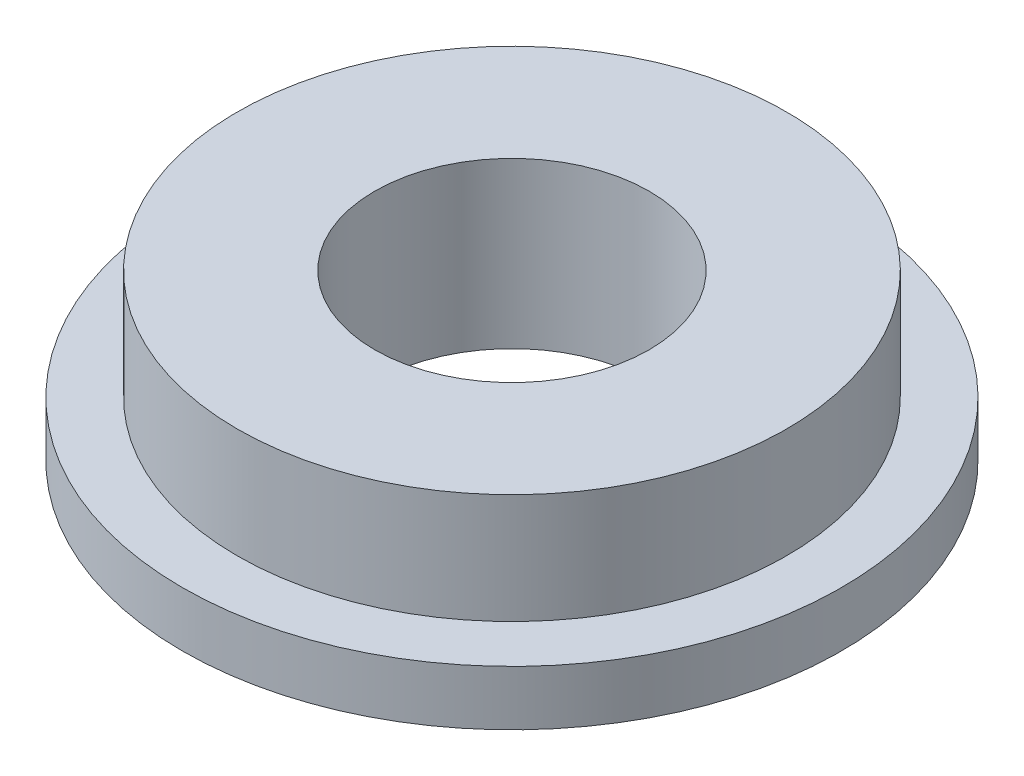
ISO-10303-21;
HEADER;
FILE_DESCRIPTION(('STEP AP214'),'2;1');
FILE_NAME('part.step','',(''),(''),'','','');
FILE_SCHEMA(('AUTOMOTIVE_DESIGN { 1 0 10303 214 1 1 1 1 }'));
ENDSEC;
DATA;
#1=APPLICATION_CONTEXT('core data for automotive mechanical design processes');
#2=APPLICATION_PROTOCOL_DEFINITION('international standard','automotive_design',2000,#1);
#3=PRODUCT_CONTEXT('',#1,'mechanical');
#4=PRODUCT('Part','Part','',(#3));
#5=PRODUCT_RELATED_PRODUCT_CATEGORY('part','',(#4));
#6=PRODUCT_DEFINITION_FORMATION('','',#4);
#7=PRODUCT_DEFINITION_CONTEXT('part definition',#1,'design');
#8=PRODUCT_DEFINITION('design','',#6,#7);
#9=PRODUCT_DEFINITION_SHAPE('','',#8);
#10=(LENGTH_UNIT() NAMED_UNIT(*) SI_UNIT(.MILLI.,.METRE.));
#11=(NAMED_UNIT(*) PLANE_ANGLE_UNIT() SI_UNIT($,.RADIAN.));
#12=(NAMED_UNIT(*) SI_UNIT($,.STERADIAN.) SOLID_ANGLE_UNIT());
#13=UNCERTAINTY_MEASURE_WITH_UNIT(LENGTH_MEASURE(1.E-05),#10,'distance_accuracy_value','');
#14=(GEOMETRIC_REPRESENTATION_CONTEXT(3) GLOBAL_UNCERTAINTY_ASSIGNED_CONTEXT((#13)) GLOBAL_UNIT_ASSIGNED_CONTEXT((#10,
#11,#12)) REPRESENTATION_CONTEXT('',''));
#15=CARTESIAN_POINT('',(0.,0.,0.));
#16=DIRECTION('',(0.,0.,1.));
#17=DIRECTION('',(1.,0.,0.));
#18=AXIS2_PLACEMENT_3D('',#15,#16,#17);
#19=CARTESIAN_POINT('',(0.,0.6,0.));
#20=DIRECTION('',(0.,1.,0.));
#21=DIRECTION('',(0.,0.,1.));
#22=AXIS2_PLACEMENT_3D('',#19,#20,#21);
#23=PLANE('',#22);
#24=CARTESIAN_POINT('',(0.,0.6,0.));
#25=DIRECTION('',(0.,1.,0.));
#26=DIRECTION('',(0.,0.,1.));
#27=AXIS2_PLACEMENT_3D('',#24,#25,#26);
#28=CIRCLE('',#27,3.6);
#29=CARTESIAN_POINT('',(0.,0.6,3.6));
#30=VERTEX_POINT('',#29);
#31=EDGE_CURVE('E11',#30,#30,#28,.T.);
#32=ORIENTED_EDGE('',*,*,#31,.T.);
#33=EDGE_LOOP('',(#32));
#34=FACE_BOUND('',#33,.T.);
#35=CARTESIAN_POINT('',(0.,0.6,0.));
#36=DIRECTION('',(0.,1.,0.));
#37=DIRECTION('',(0.,0.,1.));
#38=AXIS2_PLACEMENT_3D('',#35,#36,#37);
#39=CIRCLE('',#38,3.);
#40=CARTESIAN_POINT('',(0.,0.6,3.));
#41=VERTEX_POINT('',#40);
#42=EDGE_CURVE('E58',#41,#41,#39,.T.);
#43=ORIENTED_EDGE('',*,*,#42,.F.);
#44=EDGE_LOOP('',(#43));
#45=FACE_BOUND('',#44,.T.);
#46=ADVANCED_FACE('F45',(#34,#45),#23,.T.);
#47=CARTESIAN_POINT('',(0.,0.,0.));
#48=DIRECTION('',(0.,1.,0.));
#49=DIRECTION('',(0.,0.,1.));
#50=AXIS2_PLACEMENT_3D('',#47,#48,#49);
#51=PLANE('',#50);
#52=CARTESIAN_POINT('',(0.,0.,0.));
#53=DIRECTION('',(0.,1.,0.));
#54=DIRECTION('',(0.,0.,1.));
#55=AXIS2_PLACEMENT_3D('',#52,#53,#54);
#56=CIRCLE('',#55,3.6);
#57=CARTESIAN_POINT('',(0.,0.,3.6));
#58=VERTEX_POINT('',#57);
#59=EDGE_CURVE('E49',#58,#58,#56,.T.);
#60=ORIENTED_EDGE('',*,*,#59,.F.);
#61=EDGE_LOOP('',(#60));
#62=FACE_BOUND('',#61,.T.);
#63=CARTESIAN_POINT('',(0.,0.,0.));
#64=DIRECTION('',(0.,1.,0.));
#65=DIRECTION('',(0.,0.,1.));
#66=AXIS2_PLACEMENT_3D('',#63,#64,#65);
#67=CIRCLE('',#66,1.5);
#68=CARTESIAN_POINT('',(0.,0.,1.5));
#69=VERTEX_POINT('',#68);
#70=EDGE_CURVE('E64',#69,#69,#67,.T.);
#71=ORIENTED_EDGE('',*,*,#70,.T.);
#72=EDGE_LOOP('',(#71));
#73=FACE_BOUND('',#72,.T.);
#74=ADVANCED_FACE('F94',(#62,#73),#51,.F.);
#75=CARTESIAN_POINT('',(0.,0.6,0.));
#76=DIRECTION('',(0.,-1.,0.));
#77=DIRECTION('',(0.,0.,-1.));
#78=AXIS2_PLACEMENT_3D('',#75,#76,#77);
#79=CYLINDRICAL_SURFACE('',#78,3.6);
#80=ORIENTED_EDGE('',*,*,#31,.F.);
#81=EDGE_LOOP('',(#80));
#82=FACE_BOUND('',#81,.T.);
#83=ORIENTED_EDGE('',*,*,#59,.T.);
#84=EDGE_LOOP('',(#83));
#85=FACE_BOUND('',#84,.T.);
#86=ADVANCED_FACE('F47',(#82,#85),#79,.T.);
#87=CARTESIAN_POINT('',(0.,1.8,0.));
#88=DIRECTION('',(0.,-1.,0.));
#89=DIRECTION('',(0.,0.,-1.));
#90=AXIS2_PLACEMENT_3D('',#87,#88,#89);
#91=CYLINDRICAL_SURFACE('',#90,1.5);
#92=CARTESIAN_POINT('',(0.,1.8,0.));
#93=DIRECTION('',(0.,1.,0.));
#94=DIRECTION('',(0.,0.,1.));
#95=AXIS2_PLACEMENT_3D('',#92,#93,#94);
#96=CIRCLE('',#95,1.5);
#97=CARTESIAN_POINT('',(0.,1.8,1.5));
#98=VERTEX_POINT('',#97);
#99=EDGE_CURVE('E68',#98,#98,#96,.T.);
#100=ORIENTED_EDGE('',*,*,#99,.T.);
#101=EDGE_LOOP('',(#100));
#102=FACE_BOUND('',#101,.T.);
#103=ORIENTED_EDGE('',*,*,#70,.F.);
#104=EDGE_LOOP('',(#103));
#105=FACE_BOUND('',#104,.T.);
#106=ADVANCED_FACE('F76',(#102,#105),#91,.F.);
#107=CARTESIAN_POINT('',(0.,1.8,0.));
#108=DIRECTION('',(0.,-1.,0.));
#109=DIRECTION('',(0.,0.,-1.));
#110=AXIS2_PLACEMENT_3D('',#107,#108,#109);
#111=CYLINDRICAL_SURFACE('',#110,3.);
#112=ORIENTED_EDGE('',*,*,#42,.T.);
#113=EDGE_LOOP('',(#112));
#114=FACE_BOUND('',#113,.T.);
#115=CARTESIAN_POINT('',(0.,1.8,0.));
#116=DIRECTION('',(0.,1.,0.));
#117=DIRECTION('',(0.,0.,1.));
#118=AXIS2_PLACEMENT_3D('',#115,#116,#117);
#119=CIRCLE('',#118,3.);
#120=CARTESIAN_POINT('',(0.,1.8,3.));
#121=VERTEX_POINT('',#120);
#122=EDGE_CURVE('E63',#121,#121,#119,.T.);
#123=ORIENTED_EDGE('',*,*,#122,.F.);
#124=EDGE_LOOP('',(#123));
#125=FACE_BOUND('',#124,.T.);
#126=ADVANCED_FACE('F82',(#114,#125),#111,.T.);
#127=CARTESIAN_POINT('',(0.,1.8,0.));
#128=DIRECTION('',(0.,1.,0.));
#129=DIRECTION('',(0.,0.,1.));
#130=AXIS2_PLACEMENT_3D('',#127,#128,#129);
#131=PLANE('',#130);
#132=ORIENTED_EDGE('',*,*,#99,.F.);
#133=EDGE_LOOP('',(#132));
#134=FACE_BOUND('',#133,.T.);
#135=ORIENTED_EDGE('',*,*,#122,.T.);
#136=EDGE_LOOP('',(#135));
#137=FACE_BOUND('',#136,.T.);
#138=ADVANCED_FACE('F79',(#134,#137),#131,.T.);
#139=CLOSED_SHELL('',(#46,#74,#86,#106,#126,#138));
#140=MANIFOLD_SOLID_BREP('B2',#139);
#141=ADVANCED_BREP_SHAPE_REPRESENTATION('',(#18,#140),#14);
#142=SHAPE_DEFINITION_REPRESENTATION(#9,#141);
ENDSEC;
END-ISO-10303-21;
